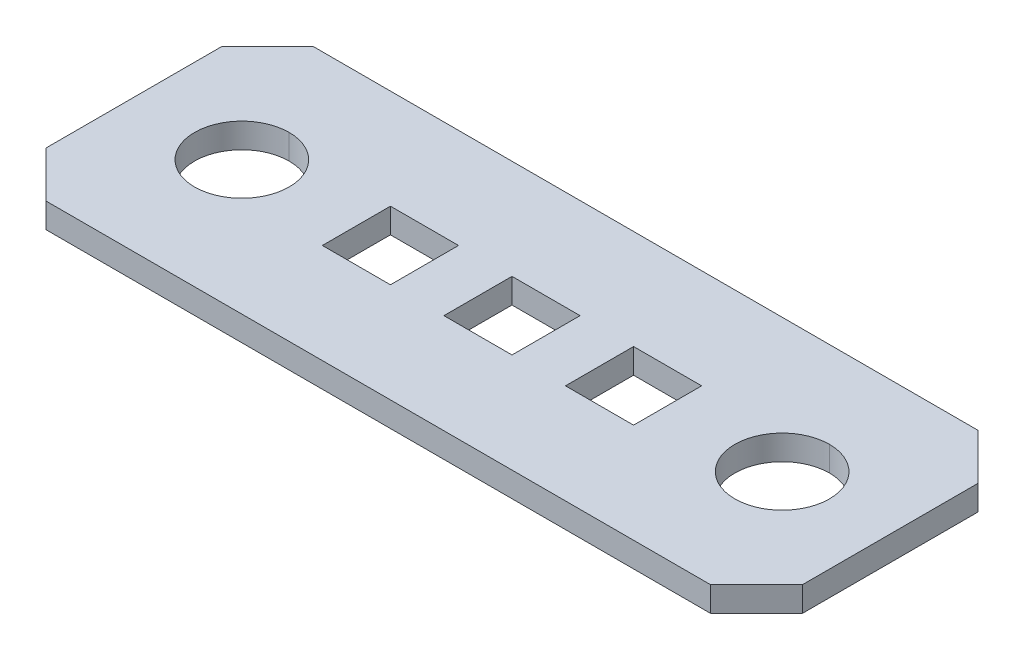
ISO-10303-21;
HEADER;
FILE_DESCRIPTION(('STEP AP214'),'2;1');
FILE_NAME('part.step','',(''),(''),'','','');
FILE_SCHEMA(('AUTOMOTIVE_DESIGN { 1 0 10303 214 1 1 1 1 }'));
ENDSEC;
DATA;
#1=APPLICATION_CONTEXT('core data for automotive mechanical design processes');
#2=APPLICATION_PROTOCOL_DEFINITION('international standard','automotive_design',2000,#1);
#3=PRODUCT_CONTEXT('',#1,'mechanical');
#4=PRODUCT('Part','Part','',(#3));
#5=PRODUCT_RELATED_PRODUCT_CATEGORY('part','',(#4));
#6=PRODUCT_DEFINITION_FORMATION('','',#4);
#7=PRODUCT_DEFINITION_CONTEXT('part definition',#1,'design');
#8=PRODUCT_DEFINITION('design','',#6,#7);
#9=PRODUCT_DEFINITION_SHAPE('','',#8);
#10=(LENGTH_UNIT() NAMED_UNIT(*) SI_UNIT(.MILLI.,.METRE.));
#11=(NAMED_UNIT(*) PLANE_ANGLE_UNIT() SI_UNIT($,.RADIAN.));
#12=(NAMED_UNIT(*) SI_UNIT($,.STERADIAN.) SOLID_ANGLE_UNIT());
#13=UNCERTAINTY_MEASURE_WITH_UNIT(LENGTH_MEASURE(1.E-05),#10,'distance_accuracy_value','');
#14=(GEOMETRIC_REPRESENTATION_CONTEXT(3) GLOBAL_UNCERTAINTY_ASSIGNED_CONTEXT((#13)) GLOBAL_UNIT_ASSIGNED_CONTEXT((#10,
#11,#12)) REPRESENTATION_CONTEXT('',''));
#15=CARTESIAN_POINT('',(0.,0.,0.));
#16=DIRECTION('',(0.,0.,1.));
#17=DIRECTION('',(1.,0.,0.));
#18=AXIS2_PLACEMENT_3D('',#15,#16,#17);
#19=CARTESIAN_POINT('',(21.8948,0.,-7.8867));
#20=DIRECTION('',(0.,0.,-1.));
#21=DIRECTION('',(0.,-1.,0.));
#22=AXIS2_PLACEMENT_3D('',#19,#20,#21);
#23=PLANE('',#22);
#24=DIRECTION('',(-1.,0.,0.));
#25=VECTOR('',#24,1.);
#26=CARTESIAN_POINT('',(21.8948,1.1684,-7.8867));
#27=LINE('',#26,#25);
#28=CARTESIAN_POINT('',(25.0952,1.1684,-7.8867));
#29=VERTEX_POINT('',#28);
#30=CARTESIAN_POINT('',(21.8948,1.1684,-7.8867));
#31=VERTEX_POINT('',#30);
#32=EDGE_CURVE('E10',#29,#31,#27,.T.);
#33=ORIENTED_EDGE('',*,*,#32,.T.);
#34=DIRECTION('',(0.,1.,0.));
#35=VECTOR('',#34,1.);
#36=CARTESIAN_POINT('',(21.8948,0.,-7.8867));
#37=LINE('',#36,#35);
#38=CARTESIAN_POINT('',(21.8948,0.,-7.8867));
#39=VERTEX_POINT('',#38);
#40=EDGE_CURVE('E45',#39,#31,#37,.T.);
#41=ORIENTED_EDGE('',*,*,#40,.F.);
#42=DIRECTION('',(-1.,0.,0.));
#43=VECTOR('',#42,1.);
#44=CARTESIAN_POINT('',(21.8948,0.,-7.8867));
#45=LINE('',#44,#43);
#46=CARTESIAN_POINT('',(25.0952,0.,-7.8867));
#47=VERTEX_POINT('',#46);
#48=EDGE_CURVE('E234',#47,#39,#45,.T.);
#49=ORIENTED_EDGE('',*,*,#48,.F.);
#50=DIRECTION('',(0.,1.,0.));
#51=VECTOR('',#50,1.);
#52=CARTESIAN_POINT('',(25.0952,0.,-7.8867));
#53=LINE('',#52,#51);
#54=EDGE_CURVE('E30',#47,#29,#53,.T.);
#55=ORIENTED_EDGE('',*,*,#54,.T.);
#56=EDGE_LOOP('',(#33,#41,#49,#55));
#57=FACE_BOUND('',#56,.T.);
#58=ADVANCED_FACE('F16',(#57),#23,.F.);
#59=CARTESIAN_POINT('',(0.,0.,0.));
#60=DIRECTION('',(0.,1.,0.));
#61=DIRECTION('',(1.,0.,0.));
#62=AXIS2_PLACEMENT_3D('',#59,#60,#61);
#63=PLANE('',#62);
#64=DIRECTION('',(-1.,0.,0.));
#65=VECTOR('',#64,1.);
#66=CARTESIAN_POINT('',(0.,0.,-12.573));
#67=LINE('',#66,#65);
#68=CARTESIAN_POINT('',(33.401,0.,-12.573));
#69=VERTEX_POINT('',#68);
#70=CARTESIAN_POINT('',(2.159,0.,-12.573));
#71=VERTEX_POINT('',#70);
#72=EDGE_CURVE('E423',#69,#71,#67,.T.);
#73=ORIENTED_EDGE('',*,*,#72,.F.);
#74=DIRECTION('',(0.707106781186544,0.,0.707106781186551));
#75=VECTOR('',#74,1.);
#76=CARTESIAN_POINT('',(33.401,0.,-12.573));
#77=LINE('',#76,#75);
#78=CARTESIAN_POINT('',(35.56,0.,-10.414));
#79=VERTEX_POINT('',#78);
#80=EDGE_CURVE('E283',#69,#79,#77,.T.);
#81=ORIENTED_EDGE('',*,*,#80,.T.);
#82=DIRECTION('',(0.,0.,-1.));
#83=VECTOR('',#82,1.);
#84=CARTESIAN_POINT('',(35.56,0.,-12.573));
#85=LINE('',#84,#83);
#86=CARTESIAN_POINT('',(35.56,0.,-2.159));
#87=VERTEX_POINT('',#86);
#88=EDGE_CURVE('E347',#87,#79,#85,.T.);
#89=ORIENTED_EDGE('',*,*,#88,.F.);
#90=DIRECTION('',(-0.707106781186548,0.,0.707106781186548));
#91=VECTOR('',#90,1.);
#92=CARTESIAN_POINT('',(35.56,0.,-2.159));
#93=LINE('',#92,#91);
#94=CARTESIAN_POINT('',(33.401,0.,0.));
#95=VERTEX_POINT('',#94);
#96=EDGE_CURVE('E401',#87,#95,#93,.T.);
#97=ORIENTED_EDGE('',*,*,#96,.T.);
#98=DIRECTION('',(1.,0.,0.));
#99=VECTOR('',#98,1.);
#100=CARTESIAN_POINT('',(0.,0.,0.));
#101=LINE('',#100,#99);
#102=CARTESIAN_POINT('',(2.159,0.,0.));
#103=VERTEX_POINT('',#102);
#104=EDGE_CURVE('E332',#103,#95,#101,.T.);
#105=ORIENTED_EDGE('',*,*,#104,.F.);
#106=DIRECTION('',(-0.707106781186548,0.,-0.707106781186548));
#107=VECTOR('',#106,1.);
#108=CARTESIAN_POINT('',(2.159,0.,0.));
#109=LINE('',#108,#107);
#110=CARTESIAN_POINT('',(0.,0.,-2.159));
#111=VERTEX_POINT('',#110);
#112=EDGE_CURVE('E398',#103,#111,#109,.T.);
#113=ORIENTED_EDGE('',*,*,#112,.T.);
#114=DIRECTION('',(0.,0.,1.));
#115=VECTOR('',#114,1.);
#116=CARTESIAN_POINT('',(0.,0.,-12.573));
#117=LINE('',#116,#115);
#118=CARTESIAN_POINT('',(0.,0.,-10.414));
#119=VERTEX_POINT('',#118);
#120=EDGE_CURVE('E311',#119,#111,#117,.T.);
#121=ORIENTED_EDGE('',*,*,#120,.F.);
#122=DIRECTION('',(0.707106781186549,0.,-0.707106781186546));
#123=VECTOR('',#122,1.);
#124=CARTESIAN_POINT('',(0.,0.,-10.414));
#125=LINE('',#124,#123);
#126=EDGE_CURVE('E383',#119,#71,#125,.T.);
#127=ORIENTED_EDGE('',*,*,#126,.T.);
#128=EDGE_LOOP('',(#73,#81,#89,#97,#105,#113,#121,#127));
#129=FACE_BOUND('',#128,.T.);
#130=CARTESIAN_POINT('',(30.48,0.,-6.2865));
#131=DIRECTION('',(0.,1.,0.));
#132=DIRECTION('',(0.,0.,1.));
#133=AXIS2_PLACEMENT_3D('',#130,#131,#132);
#134=CIRCLE('',#133,2.2225);
#135=CARTESIAN_POINT('',(30.48,0.,-4.064));
#136=VERTEX_POINT('',#135);
#137=CARTESIAN_POINT('',(30.48,0.,-8.509));
#138=VERTEX_POINT('',#137);
#139=EDGE_CURVE('E377',#136,#138,#134,.T.);
#140=ORIENTED_EDGE('',*,*,#139,.T.);
#141=CARTESIAN_POINT('',(30.48,0.,-6.2865));
#142=DIRECTION('',(0.,1.,0.));
#143=DIRECTION('',(0.,0.,1.));
#144=AXIS2_PLACEMENT_3D('',#141,#142,#143);
#145=CIRCLE('',#144,2.2225);
#146=EDGE_CURVE('E376',#138,#136,#145,.T.);
#147=ORIENTED_EDGE('',*,*,#146,.T.);
#148=EDGE_LOOP('',(#140,#147));
#149=FACE_BOUND('',#148,.T.);
#150=CARTESIAN_POINT('',(5.08,0.,-6.2865));
#151=DIRECTION('',(0.,1.,0.));
#152=DIRECTION('',(0.,0.,1.));
#153=AXIS2_PLACEMENT_3D('',#150,#151,#152);
#154=CIRCLE('',#153,2.2225);
#155=CARTESIAN_POINT('',(5.08,0.,-4.064));
#156=VERTEX_POINT('',#155);
#157=CARTESIAN_POINT('',(5.08,0.,-8.509));
#158=VERTEX_POINT('',#157);
#159=EDGE_CURVE('E379',#156,#158,#154,.T.);
#160=ORIENTED_EDGE('',*,*,#159,.T.);
#161=CARTESIAN_POINT('',(5.08,0.,-6.2865));
#162=DIRECTION('',(0.,1.,0.));
#163=DIRECTION('',(0.,0.,1.));
#164=AXIS2_PLACEMENT_3D('',#161,#162,#163);
#165=CIRCLE('',#164,2.2225);
#166=EDGE_CURVE('E278',#158,#156,#165,.T.);
#167=ORIENTED_EDGE('',*,*,#166,.T.);
#168=EDGE_LOOP('',(#160,#167));
#169=FACE_BOUND('',#168,.T.);
#170=DIRECTION('',(-1.,0.,0.));
#171=VECTOR('',#170,1.);
#172=CARTESIAN_POINT('',(16.1798,0.,-7.8867));
#173=LINE('',#172,#171);
#174=CARTESIAN_POINT('',(19.3802,0.,-7.8867));
#175=VERTEX_POINT('',#174);
#176=CARTESIAN_POINT('',(16.1798,0.,-7.8867));
#177=VERTEX_POINT('',#176);
#178=EDGE_CURVE('E277',#175,#177,#173,.T.);
#179=ORIENTED_EDGE('',*,*,#178,.T.);
#180=DIRECTION('',(0.,0.,1.));
#181=VECTOR('',#180,1.);
#182=CARTESIAN_POINT('',(16.1798,0.,-7.8867));
#183=LINE('',#182,#181);
#184=CARTESIAN_POINT('',(16.1798,0.,-4.6863));
#185=VERTEX_POINT('',#184);
#186=EDGE_CURVE('E281',#177,#185,#183,.T.);
#187=ORIENTED_EDGE('',*,*,#186,.T.);
#188=DIRECTION('',(1.,0.,0.));
#189=VECTOR('',#188,1.);
#190=CARTESIAN_POINT('',(16.1798,0.,-4.6863));
#191=LINE('',#190,#189);
#192=CARTESIAN_POINT('',(19.3802,0.,-4.6863));
#193=VERTEX_POINT('',#192);
#194=EDGE_CURVE('E343',#185,#193,#191,.T.);
#195=ORIENTED_EDGE('',*,*,#194,.T.);
#196=DIRECTION('',(0.,0.,-1.));
#197=VECTOR('',#196,1.);
#198=CARTESIAN_POINT('',(19.3802,0.,-7.8867));
#199=LINE('',#198,#197);
#200=EDGE_CURVE('E341',#193,#175,#199,.T.);
#201=ORIENTED_EDGE('',*,*,#200,.T.);
#202=EDGE_LOOP('',(#179,#187,#195,#201));
#203=FACE_BOUND('',#202,.T.);
#204=DIRECTION('',(-1.,0.,0.));
#205=VECTOR('',#204,1.);
#206=CARTESIAN_POINT('',(10.4648,0.,-7.8867));
#207=LINE('',#206,#205);
#208=CARTESIAN_POINT('',(13.6652,0.,-7.8867));
#209=VERTEX_POINT('',#208);
#210=CARTESIAN_POINT('',(10.4648,0.,-7.8867));
#211=VERTEX_POINT('',#210);
#212=EDGE_CURVE('E342',#209,#211,#207,.T.);
#213=ORIENTED_EDGE('',*,*,#212,.T.);
#214=DIRECTION('',(0.,0.,1.));
#215=VECTOR('',#214,1.);
#216=CARTESIAN_POINT('',(10.4648,0.,-7.8867));
#217=LINE('',#216,#215);
#218=CARTESIAN_POINT('',(10.4648,0.,-4.6863));
#219=VERTEX_POINT('',#218);
#220=EDGE_CURVE('E315',#211,#219,#217,.T.);
#221=ORIENTED_EDGE('',*,*,#220,.T.);
#222=DIRECTION('',(1.,0.,0.));
#223=VECTOR('',#222,1.);
#224=CARTESIAN_POINT('',(10.4648,0.,-4.6863));
#225=LINE('',#224,#223);
#226=CARTESIAN_POINT('',(13.6652,0.,-4.6863));
#227=VERTEX_POINT('',#226);
#228=EDGE_CURVE('E306',#219,#227,#225,.T.);
#229=ORIENTED_EDGE('',*,*,#228,.T.);
#230=DIRECTION('',(0.,0.,-1.));
#231=VECTOR('',#230,1.);
#232=CARTESIAN_POINT('',(13.6652,0.,-7.8867));
#233=LINE('',#232,#231);
#234=EDGE_CURVE('E236',#227,#209,#233,.T.);
#235=ORIENTED_EDGE('',*,*,#234,.T.);
#236=EDGE_LOOP('',(#213,#221,#229,#235));
#237=FACE_BOUND('',#236,.T.);
#238=DIRECTION('',(0.,0.,1.));
#239=VECTOR('',#238,1.);
#240=CARTESIAN_POINT('',(21.8948,0.,-7.8867));
#241=LINE('',#240,#239);
#242=CARTESIAN_POINT('',(21.8948,0.,-4.6863));
#243=VERTEX_POINT('',#242);
#244=EDGE_CURVE('E230',#39,#243,#241,.T.);
#245=ORIENTED_EDGE('',*,*,#244,.T.);
#246=DIRECTION('',(1.,0.,0.));
#247=VECTOR('',#246,1.);
#248=CARTESIAN_POINT('',(21.8948,0.,-4.6863));
#249=LINE('',#248,#247);
#250=CARTESIAN_POINT('',(25.0952,0.,-4.6863));
#251=VERTEX_POINT('',#250);
#252=EDGE_CURVE('E219',#243,#251,#249,.T.);
#253=ORIENTED_EDGE('',*,*,#252,.T.);
#254=DIRECTION('',(0.,0.,-1.));
#255=VECTOR('',#254,1.);
#256=CARTESIAN_POINT('',(25.0952,0.,-7.8867));
#257=LINE('',#256,#255);
#258=EDGE_CURVE('E231',#251,#47,#257,.T.);
#259=ORIENTED_EDGE('',*,*,#258,.T.);
#260=ORIENTED_EDGE('',*,*,#48,.T.);
#261=EDGE_LOOP('',(#245,#253,#259,#260));
#262=FACE_BOUND('',#261,.T.);
#263=ADVANCED_FACE('F232',(#129,#149,#169,#203,#237,#262),#63,.F.);
#264=CARTESIAN_POINT('',(0.,1.1684,0.));
#265=DIRECTION('',(0.,1.,0.));
#266=DIRECTION('',(1.,0.,0.));
#267=AXIS2_PLACEMENT_3D('',#264,#265,#266);
#268=PLANE('',#267);
#269=DIRECTION('',(0.,0.,-1.));
#270=VECTOR('',#269,1.);
#271=CARTESIAN_POINT('',(35.56,1.1684,-12.573));
#272=LINE('',#271,#270);
#273=CARTESIAN_POINT('',(35.56,1.1684,-2.159));
#274=VERTEX_POINT('',#273);
#275=CARTESIAN_POINT('',(35.56,1.1684,-10.414));
#276=VERTEX_POINT('',#275);
#277=EDGE_CURVE('E290',#274,#276,#272,.T.);
#278=ORIENTED_EDGE('',*,*,#277,.T.);
#279=DIRECTION('',(-0.707106781186544,0.,-0.707106781186551));
#280=VECTOR('',#279,1.);
#281=CARTESIAN_POINT('',(22.987,1.1684,-22.987));
#282=LINE('',#281,#280);
#283=CARTESIAN_POINT('',(33.401,1.1684,-12.573));
#284=VERTEX_POINT('',#283);
#285=EDGE_CURVE('E295',#276,#284,#282,.T.);
#286=ORIENTED_EDGE('',*,*,#285,.T.);
#287=DIRECTION('',(-1.,0.,0.));
#288=VECTOR('',#287,1.);
#289=CARTESIAN_POINT('',(0.,1.1684,-12.573));
#290=LINE('',#289,#288);
#291=CARTESIAN_POINT('',(2.159,1.1684,-12.573));
#292=VERTEX_POINT('',#291);
#293=EDGE_CURVE('E316',#284,#292,#290,.T.);
#294=ORIENTED_EDGE('',*,*,#293,.T.);
#295=DIRECTION('',(-0.707106781186549,0.,0.707106781186546));
#296=VECTOR('',#295,1.);
#297=CARTESIAN_POINT('',(-5.207,1.1684,-5.207));
#298=LINE('',#297,#296);
#299=CARTESIAN_POINT('',(0.,1.1684,-10.414));
#300=VERTEX_POINT('',#299);
#301=EDGE_CURVE('E319',#292,#300,#298,.T.);
#302=ORIENTED_EDGE('',*,*,#301,.T.);
#303=DIRECTION('',(0.,0.,1.));
#304=VECTOR('',#303,1.);
#305=CARTESIAN_POINT('',(0.,1.1684,-12.573));
#306=LINE('',#305,#304);
#307=CARTESIAN_POINT('',(0.,1.1684,-2.159));
#308=VERTEX_POINT('',#307);
#309=EDGE_CURVE('E575',#300,#308,#306,.T.);
#310=ORIENTED_EDGE('',*,*,#309,.T.);
#311=DIRECTION('',(0.707106781186548,0.,0.707106781186548));
#312=VECTOR('',#311,1.);
#313=CARTESIAN_POINT('',(1.0795,1.1684,-1.0795));
#314=LINE('',#313,#312);
#315=CARTESIAN_POINT('',(2.159,1.1684,0.));
#316=VERTEX_POINT('',#315);
#317=EDGE_CURVE('E417',#308,#316,#314,.T.);
#318=ORIENTED_EDGE('',*,*,#317,.T.);
#319=DIRECTION('',(1.,0.,0.));
#320=VECTOR('',#319,1.);
#321=CARTESIAN_POINT('',(0.,1.1684,0.));
#322=LINE('',#321,#320);
#323=CARTESIAN_POINT('',(33.401,1.1684,0.));
#324=VERTEX_POINT('',#323);
#325=EDGE_CURVE('E412',#316,#324,#322,.T.);
#326=ORIENTED_EDGE('',*,*,#325,.T.);
#327=DIRECTION('',(0.707106781186548,0.,-0.707106781186548));
#328=VECTOR('',#327,1.);
#329=CARTESIAN_POINT('',(16.7005,1.1684,16.7005));
#330=LINE('',#329,#328);
#331=EDGE_CURVE('E416',#324,#274,#330,.T.);
#332=ORIENTED_EDGE('',*,*,#331,.T.);
#333=EDGE_LOOP('',(#278,#286,#294,#302,#310,#318,#326,#332));
#334=FACE_BOUND('',#333,.T.);
#335=CARTESIAN_POINT('',(30.48,1.1684,-6.2865));
#336=DIRECTION('',(0.,1.,0.));
#337=DIRECTION('',(0.,0.,1.));
#338=AXIS2_PLACEMENT_3D('',#335,#336,#337);
#339=CIRCLE('',#338,2.2225);
#340=CARTESIAN_POINT('',(30.48,1.1684,-4.064));
#341=VERTEX_POINT('',#340);
#342=CARTESIAN_POINT('',(30.48,1.1684,-8.509));
#343=VERTEX_POINT('',#342);
#344=EDGE_CURVE('E270',#341,#343,#339,.T.);
#345=ORIENTED_EDGE('',*,*,#344,.F.);
#346=CARTESIAN_POINT('',(30.48,1.1684,-6.2865));
#347=DIRECTION('',(0.,1.,0.));
#348=DIRECTION('',(0.,0.,1.));
#349=AXIS2_PLACEMENT_3D('',#346,#347,#348);
#350=CIRCLE('',#349,2.2225);
#351=EDGE_CURVE('E437',#343,#341,#350,.T.);
#352=ORIENTED_EDGE('',*,*,#351,.F.);
#353=EDGE_LOOP('',(#345,#352));
#354=FACE_BOUND('',#353,.T.);
#355=CARTESIAN_POINT('',(5.08,1.1684,-6.2865));
#356=DIRECTION('',(0.,1.,0.));
#357=DIRECTION('',(0.,0.,1.));
#358=AXIS2_PLACEMENT_3D('',#355,#356,#357);
#359=CIRCLE('',#358,2.2225);
#360=CARTESIAN_POINT('',(5.08,1.1684,-4.064));
#361=VERTEX_POINT('',#360);
#362=CARTESIAN_POINT('',(5.08,1.1684,-8.509));
#363=VERTEX_POINT('',#362);
#364=EDGE_CURVE('E253',#361,#363,#359,.T.);
#365=ORIENTED_EDGE('',*,*,#364,.F.);
#366=CARTESIAN_POINT('',(5.08,1.1684,-6.2865));
#367=DIRECTION('',(0.,1.,0.));
#368=DIRECTION('',(0.,0.,1.));
#369=AXIS2_PLACEMENT_3D('',#366,#367,#368);
#370=CIRCLE('',#369,2.2225);
#371=EDGE_CURVE('E259',#363,#361,#370,.T.);
#372=ORIENTED_EDGE('',*,*,#371,.F.);
#373=EDGE_LOOP('',(#365,#372));
#374=FACE_BOUND('',#373,.T.);
#375=DIRECTION('',(0.,0.,1.));
#376=VECTOR('',#375,1.);
#377=CARTESIAN_POINT('',(16.1798,1.1684,-7.8867));
#378=LINE('',#377,#376);
#379=CARTESIAN_POINT('',(16.1798,1.1684,-7.8867));
#380=VERTEX_POINT('',#379);
#381=CARTESIAN_POINT('',(16.1798,1.1684,-4.6863));
#382=VERTEX_POINT('',#381);
#383=EDGE_CURVE('E307',#380,#382,#378,.T.);
#384=ORIENTED_EDGE('',*,*,#383,.F.);
#385=DIRECTION('',(-1.,0.,0.));
#386=VECTOR('',#385,1.);
#387=CARTESIAN_POINT('',(16.1798,1.1684,-7.8867));
#388=LINE('',#387,#386);
#389=CARTESIAN_POINT('',(19.3802,1.1684,-7.8867));
#390=VERTEX_POINT('',#389);
#391=EDGE_CURVE('E243',#390,#380,#388,.T.);
#392=ORIENTED_EDGE('',*,*,#391,.F.);
#393=DIRECTION('',(0.,0.,-1.));
#394=VECTOR('',#393,1.);
#395=CARTESIAN_POINT('',(19.3802,1.1684,-7.8867));
#396=LINE('',#395,#394);
#397=CARTESIAN_POINT('',(19.3802,1.1684,-4.6863));
#398=VERTEX_POINT('',#397);
#399=EDGE_CURVE('E291',#398,#390,#396,.T.);
#400=ORIENTED_EDGE('',*,*,#399,.F.);
#401=DIRECTION('',(1.,0.,0.));
#402=VECTOR('',#401,1.);
#403=CARTESIAN_POINT('',(16.1798,1.1684,-4.6863));
#404=LINE('',#403,#402);
#405=EDGE_CURVE('E305',#382,#398,#404,.T.);
#406=ORIENTED_EDGE('',*,*,#405,.F.);
#407=EDGE_LOOP('',(#384,#392,#400,#406));
#408=FACE_BOUND('',#407,.T.);
#409=DIRECTION('',(0.,0.,1.));
#410=VECTOR('',#409,1.);
#411=CARTESIAN_POINT('',(10.4648,1.1684,-7.8867));
#412=LINE('',#411,#410);
#413=CARTESIAN_POINT('',(10.4648,1.1684,-7.8867));
#414=VERTEX_POINT('',#413);
#415=CARTESIAN_POINT('',(10.4648,1.1684,-4.6863));
#416=VERTEX_POINT('',#415);
#417=EDGE_CURVE('E324',#414,#416,#412,.T.);
#418=ORIENTED_EDGE('',*,*,#417,.F.);
#419=DIRECTION('',(-1.,0.,0.));
#420=VECTOR('',#419,1.);
#421=CARTESIAN_POINT('',(10.4648,1.1684,-7.8867));
#422=LINE('',#421,#420);
#423=CARTESIAN_POINT('',(13.6652,1.1684,-7.8867));
#424=VERTEX_POINT('',#423);
#425=EDGE_CURVE('E375',#424,#414,#422,.T.);
#426=ORIENTED_EDGE('',*,*,#425,.F.);
#427=DIRECTION('',(0.,0.,-1.));
#428=VECTOR('',#427,1.);
#429=CARTESIAN_POINT('',(13.6652,1.1684,-7.8867));
#430=LINE('',#429,#428);
#431=CARTESIAN_POINT('',(13.6652,1.1684,-4.6863));
#432=VERTEX_POINT('',#431);
#433=EDGE_CURVE('E333',#432,#424,#430,.T.);
#434=ORIENTED_EDGE('',*,*,#433,.F.);
#435=DIRECTION('',(1.,0.,0.));
#436=VECTOR('',#435,1.);
#437=CARTESIAN_POINT('',(10.4648,1.1684,-4.6863));
#438=LINE('',#437,#436);
#439=EDGE_CURVE('E321',#416,#432,#438,.T.);
#440=ORIENTED_EDGE('',*,*,#439,.F.);
#441=EDGE_LOOP('',(#418,#426,#434,#440));
#442=FACE_BOUND('',#441,.T.);
#443=DIRECTION('',(0.,0.,1.));
#444=VECTOR('',#443,1.);
#445=CARTESIAN_POINT('',(21.8948,1.1684,-7.8867));
#446=LINE('',#445,#444);
#447=CARTESIAN_POINT('',(21.8948,1.1684,-4.6863));
#448=VERTEX_POINT('',#447);
#449=EDGE_CURVE('E241',#31,#448,#446,.T.);
#450=ORIENTED_EDGE('',*,*,#449,.F.);
#451=ORIENTED_EDGE('',*,*,#32,.F.);
#452=DIRECTION('',(0.,0.,-1.));
#453=VECTOR('',#452,1.);
#454=CARTESIAN_POINT('',(25.0952,1.1684,-7.8867));
#455=LINE('',#454,#453);
#456=CARTESIAN_POINT('',(25.0952,1.1684,-4.6863));
#457=VERTEX_POINT('',#456);
#458=EDGE_CURVE('E263',#457,#29,#455,.T.);
#459=ORIENTED_EDGE('',*,*,#458,.F.);
#460=DIRECTION('',(1.,0.,0.));
#461=VECTOR('',#460,1.);
#462=CARTESIAN_POINT('',(21.8948,1.1684,-4.6863));
#463=LINE('',#462,#461);
#464=EDGE_CURVE('E242',#448,#457,#463,.T.);
#465=ORIENTED_EDGE('',*,*,#464,.F.);
#466=EDGE_LOOP('',(#450,#451,#459,#465));
#467=FACE_BOUND('',#466,.T.);
#468=ADVANCED_FACE('F471',(#334,#354,#374,#408,#442,#467),#268,.T.);
#469=CARTESIAN_POINT('',(21.8948,0.,-7.8867));
#470=DIRECTION('',(-1.,0.,0.));
#471=DIRECTION('',(0.,0.,1.));
#472=AXIS2_PLACEMENT_3D('',#469,#470,#471);
#473=PLANE('',#472);
#474=ORIENTED_EDGE('',*,*,#449,.T.);
#475=DIRECTION('',(0.,1.,0.));
#476=VECTOR('',#475,1.);
#477=CARTESIAN_POINT('',(21.8948,0.,-4.6863));
#478=LINE('',#477,#476);
#479=EDGE_CURVE('E221',#243,#448,#478,.T.);
#480=ORIENTED_EDGE('',*,*,#479,.F.);
#481=ORIENTED_EDGE('',*,*,#244,.F.);
#482=ORIENTED_EDGE('',*,*,#40,.T.);
#483=EDGE_LOOP('',(#474,#480,#481,#482));
#484=FACE_BOUND('',#483,.T.);
#485=ADVANCED_FACE('F237',(#484),#473,.F.);
#486=CARTESIAN_POINT('',(25.0952,0.,-7.8867));
#487=DIRECTION('',(1.,0.,0.));
#488=DIRECTION('',(0.,1.,0.));
#489=AXIS2_PLACEMENT_3D('',#486,#487,#488);
#490=PLANE('',#489);
#491=ORIENTED_EDGE('',*,*,#458,.T.);
#492=ORIENTED_EDGE('',*,*,#54,.F.);
#493=ORIENTED_EDGE('',*,*,#258,.F.);
#494=DIRECTION('',(0.,1.,0.));
#495=VECTOR('',#494,1.);
#496=CARTESIAN_POINT('',(25.0952,0.,-4.6863));
#497=LINE('',#496,#495);
#498=EDGE_CURVE('E226',#251,#457,#497,.T.);
#499=ORIENTED_EDGE('',*,*,#498,.T.);
#500=EDGE_LOOP('',(#491,#492,#493,#499));
#501=FACE_BOUND('',#500,.T.);
#502=ADVANCED_FACE('F489',(#501),#490,.F.);
#503=CARTESIAN_POINT('',(35.56,1.1684,-12.573));
#504=DIRECTION('',(-1.,0.,0.));
#505=DIRECTION('',(0.,0.,1.));
#506=AXIS2_PLACEMENT_3D('',#503,#504,#505);
#507=PLANE('',#506);
#508=ORIENTED_EDGE('',*,*,#88,.T.);
#509=DIRECTION('',(0.,1.,0.));
#510=VECTOR('',#509,1.);
#511=CARTESIAN_POINT('',(35.56,1.1684,-10.414));
#512=LINE('',#511,#510);
#513=EDGE_CURVE('E301',#79,#276,#512,.T.);
#514=ORIENTED_EDGE('',*,*,#513,.T.);
#515=ORIENTED_EDGE('',*,*,#277,.F.);
#516=DIRECTION('',(0.,-1.,0.));
#517=VECTOR('',#516,1.);
#518=CARTESIAN_POINT('',(35.56,1.1684,-2.159));
#519=LINE('',#518,#517);
#520=EDGE_CURVE('E300',#274,#87,#519,.T.);
#521=ORIENTED_EDGE('',*,*,#520,.T.);
#522=EDGE_LOOP('',(#508,#514,#515,#521));
#523=FACE_BOUND('',#522,.T.);
#524=ADVANCED_FACE('F594',(#523),#507,.F.);
#525=CARTESIAN_POINT('',(16.1798,0.,-4.6863));
#526=DIRECTION('',(0.,0.,1.));
#527=DIRECTION('',(1.,0.,0.));
#528=AXIS2_PLACEMENT_3D('',#525,#526,#527);
#529=PLANE('',#528);
#530=ORIENTED_EDGE('',*,*,#405,.T.);
#531=DIRECTION('',(0.,1.,0.));
#532=VECTOR('',#531,1.);
#533=CARTESIAN_POINT('',(19.3802,0.,-4.6863));
#534=LINE('',#533,#532);
#535=EDGE_CURVE('E296',#193,#398,#534,.T.);
#536=ORIENTED_EDGE('',*,*,#535,.F.);
#537=ORIENTED_EDGE('',*,*,#194,.F.);
#538=DIRECTION('',(0.,1.,0.));
#539=VECTOR('',#538,1.);
#540=CARTESIAN_POINT('',(16.1798,0.,-4.6863));
#541=LINE('',#540,#539);
#542=EDGE_CURVE('E303',#185,#382,#541,.T.);
#543=ORIENTED_EDGE('',*,*,#542,.T.);
#544=EDGE_LOOP('',(#530,#536,#537,#543));
#545=FACE_BOUND('',#544,.T.);
#546=ADVANCED_FACE('F530',(#545),#529,.F.);
#547=CARTESIAN_POINT('',(16.1798,0.,-7.8867));
#548=DIRECTION('',(-1.,0.,0.));
#549=DIRECTION('',(0.,0.,1.));
#550=AXIS2_PLACEMENT_3D('',#547,#548,#549);
#551=PLANE('',#550);
#552=ORIENTED_EDGE('',*,*,#383,.T.);
#553=ORIENTED_EDGE('',*,*,#542,.F.);
#554=ORIENTED_EDGE('',*,*,#186,.F.);
#555=DIRECTION('',(0.,1.,0.));
#556=VECTOR('',#555,1.);
#557=CARTESIAN_POINT('',(16.1798,0.,-7.8867));
#558=LINE('',#557,#556);
#559=EDGE_CURVE('E393',#177,#380,#558,.T.);
#560=ORIENTED_EDGE('',*,*,#559,.T.);
#561=EDGE_LOOP('',(#552,#553,#554,#560));
#562=FACE_BOUND('',#561,.T.);
#563=ADVANCED_FACE('F524',(#562),#551,.F.);
#564=CARTESIAN_POINT('',(10.4648,0.,-7.8867));
#565=DIRECTION('',(0.,0.,-1.));
#566=DIRECTION('',(0.,-1.,0.));
#567=AXIS2_PLACEMENT_3D('',#564,#565,#566);
#568=PLANE('',#567);
#569=ORIENTED_EDGE('',*,*,#425,.T.);
#570=DIRECTION('',(0.,1.,0.));
#571=VECTOR('',#570,1.);
#572=CARTESIAN_POINT('',(10.4648,0.,-7.8867));
#573=LINE('',#572,#571);
#574=EDGE_CURVE('E329',#211,#414,#573,.T.);
#575=ORIENTED_EDGE('',*,*,#574,.F.);
#576=ORIENTED_EDGE('',*,*,#212,.F.);
#577=DIRECTION('',(0.,1.,0.));
#578=VECTOR('',#577,1.);
#579=CARTESIAN_POINT('',(13.6652,0.,-7.8867));
#580=LINE('',#579,#578);
#581=EDGE_CURVE('E369',#209,#424,#580,.T.);
#582=ORIENTED_EDGE('',*,*,#581,.T.);
#583=EDGE_LOOP('',(#569,#575,#576,#582));
#584=FACE_BOUND('',#583,.T.);
#585=ADVANCED_FACE('F526',(#584),#568,.F.);
#586=CARTESIAN_POINT('',(5.08,0.,-6.2865));
#587=DIRECTION('',(0.,1.,0.));
#588=DIRECTION('',(0.,0.,1.));
#589=AXIS2_PLACEMENT_3D('',#586,#587,#588);
#590=CYLINDRICAL_SURFACE('',#589,2.2225);
#591=DIRECTION('',(0.,1.,0.));
#592=VECTOR('',#591,1.);
#593=CARTESIAN_POINT('',(5.08,0.,-8.509));
#594=LINE('',#593,#592);
#595=EDGE_CURVE('E261',#158,#363,#594,.T.);
#596=ORIENTED_EDGE('',*,*,#595,.F.);
#597=ORIENTED_EDGE('',*,*,#159,.F.);
#598=DIRECTION('',(0.,1.,0.));
#599=VECTOR('',#598,1.);
#600=CARTESIAN_POINT('',(5.08,0.,-4.064));
#601=LINE('',#600,#599);
#602=EDGE_CURVE('E274',#156,#361,#601,.T.);
#603=ORIENTED_EDGE('',*,*,#602,.T.);
#604=ORIENTED_EDGE('',*,*,#364,.T.);
#605=EDGE_LOOP('',(#596,#597,#603,#604));
#606=FACE_BOUND('',#605,.T.);
#607=ADVANCED_FACE('F468',(#606),#590,.F.);
#608=CARTESIAN_POINT('',(21.8948,0.,-4.6863));
#609=DIRECTION('',(0.,0.,1.));
#610=DIRECTION('',(1.,0.,0.));
#611=AXIS2_PLACEMENT_3D('',#608,#609,#610);
#612=PLANE('',#611);
#613=ORIENTED_EDGE('',*,*,#464,.T.);
#614=ORIENTED_EDGE('',*,*,#498,.F.);
#615=ORIENTED_EDGE('',*,*,#252,.F.);
#616=ORIENTED_EDGE('',*,*,#479,.T.);
#617=EDGE_LOOP('',(#613,#614,#615,#616));
#618=FACE_BOUND('',#617,.T.);
#619=ADVANCED_FACE('F225',(#618),#612,.F.);
#620=CARTESIAN_POINT('',(16.1798,0.,-7.8867));
#621=DIRECTION('',(0.,0.,-1.));
#622=DIRECTION('',(0.,-1.,0.));
#623=AXIS2_PLACEMENT_3D('',#620,#621,#622);
#624=PLANE('',#623);
#625=ORIENTED_EDGE('',*,*,#391,.T.);
#626=ORIENTED_EDGE('',*,*,#559,.F.);
#627=ORIENTED_EDGE('',*,*,#178,.F.);
#628=DIRECTION('',(0.,1.,0.));
#629=VECTOR('',#628,1.);
#630=CARTESIAN_POINT('',(19.3802,0.,-7.8867));
#631=LINE('',#630,#629);
#632=EDGE_CURVE('E255',#175,#390,#631,.T.);
#633=ORIENTED_EDGE('',*,*,#632,.T.);
#634=EDGE_LOOP('',(#625,#626,#627,#633));
#635=FACE_BOUND('',#634,.T.);
#636=ADVANCED_FACE('F623',(#635),#624,.F.);
#637=CARTESIAN_POINT('',(0.,1.1684,0.));
#638=DIRECTION('',(0.,0.,-1.));
#639=DIRECTION('',(0.,-1.,0.));
#640=AXIS2_PLACEMENT_3D('',#637,#638,#639);
#641=PLANE('',#640);
#642=ORIENTED_EDGE('',*,*,#104,.T.);
#643=DIRECTION('',(0.,1.,0.));
#644=VECTOR('',#643,1.);
#645=CARTESIAN_POINT('',(33.401,1.1684,0.));
#646=LINE('',#645,#644);
#647=EDGE_CURVE('E331',#95,#324,#646,.T.);
#648=ORIENTED_EDGE('',*,*,#647,.T.);
#649=ORIENTED_EDGE('',*,*,#325,.F.);
#650=DIRECTION('',(0.,-1.,0.));
#651=VECTOR('',#650,1.);
#652=CARTESIAN_POINT('',(2.159,1.1684,0.));
#653=LINE('',#652,#651);
#654=EDGE_CURVE('E328',#316,#103,#653,.T.);
#655=ORIENTED_EDGE('',*,*,#654,.T.);
#656=EDGE_LOOP('',(#642,#648,#649,#655));
#657=FACE_BOUND('',#656,.T.);
#658=ADVANCED_FACE('F506',(#657),#641,.F.);
#659=CARTESIAN_POINT('',(33.401,1.1684,-12.573));
#660=DIRECTION('',(-0.707106781186551,0.,0.707106781186544));
#661=DIRECTION('',(0.,1.,0.));
#662=AXIS2_PLACEMENT_3D('',#659,#660,#661);
#663=PLANE('',#662);
#664=ORIENTED_EDGE('',*,*,#285,.F.);
#665=ORIENTED_EDGE('',*,*,#513,.F.);
#666=ORIENTED_EDGE('',*,*,#80,.F.);
#667=DIRECTION('',(0.,-1.,0.));
#668=VECTOR('',#667,1.);
#669=CARTESIAN_POINT('',(33.401,1.1684,-12.573));
#670=LINE('',#669,#668);
#671=EDGE_CURVE('E389',#284,#69,#670,.T.);
#672=ORIENTED_EDGE('',*,*,#671,.F.);
#673=EDGE_LOOP('',(#664,#665,#666,#672));
#674=FACE_BOUND('',#673,.T.);
#675=ADVANCED_FACE('F504',(#674),#663,.F.);
#676=CARTESIAN_POINT('',(10.4648,0.,-7.8867));
#677=DIRECTION('',(-1.,0.,0.));
#678=DIRECTION('',(0.,0.,1.));
#679=AXIS2_PLACEMENT_3D('',#676,#677,#678);
#680=PLANE('',#679);
#681=ORIENTED_EDGE('',*,*,#417,.T.);
#682=DIRECTION('',(0.,1.,0.));
#683=VECTOR('',#682,1.);
#684=CARTESIAN_POINT('',(10.4648,0.,-4.6863));
#685=LINE('',#684,#683);
#686=EDGE_CURVE('E322',#219,#416,#685,.T.);
#687=ORIENTED_EDGE('',*,*,#686,.F.);
#688=ORIENTED_EDGE('',*,*,#220,.F.);
#689=ORIENTED_EDGE('',*,*,#574,.T.);
#690=EDGE_LOOP('',(#681,#687,#688,#689));
#691=FACE_BOUND('',#690,.T.);
#692=ADVANCED_FACE('F505',(#691),#680,.F.);
#693=CARTESIAN_POINT('',(0.,1.1684,-10.414));
#694=DIRECTION('',(0.707106781186546,0.,0.707106781186549));
#695=DIRECTION('',(0.,-1.,0.));
#696=AXIS2_PLACEMENT_3D('',#693,#694,#695);
#697=PLANE('',#696);
#698=ORIENTED_EDGE('',*,*,#301,.F.);
#699=DIRECTION('',(0.,1.,0.));
#700=VECTOR('',#699,1.);
#701=CARTESIAN_POINT('',(2.159,1.1684,-12.573));
#702=LINE('',#701,#700);
#703=EDGE_CURVE('E339',#71,#292,#702,.T.);
#704=ORIENTED_EDGE('',*,*,#703,.F.);
#705=ORIENTED_EDGE('',*,*,#126,.F.);
#706=DIRECTION('',(0.,-1.,0.));
#707=VECTOR('',#706,1.);
#708=CARTESIAN_POINT('',(0.,1.1684,-10.414));
#709=LINE('',#708,#707);
#710=EDGE_CURVE('E260',#300,#119,#709,.T.);
#711=ORIENTED_EDGE('',*,*,#710,.F.);
#712=EDGE_LOOP('',(#698,#704,#705,#711));
#713=FACE_BOUND('',#712,.T.);
#714=ADVANCED_FACE('F525',(#713),#697,.F.);
#715=CARTESIAN_POINT('',(0.,1.1684,-12.573));
#716=DIRECTION('',(0.,0.,1.));
#717=DIRECTION('',(1.,0.,0.));
#718=AXIS2_PLACEMENT_3D('',#715,#716,#717);
#719=PLANE('',#718);
#720=ORIENTED_EDGE('',*,*,#293,.F.);
#721=ORIENTED_EDGE('',*,*,#671,.T.);
#722=ORIENTED_EDGE('',*,*,#72,.T.);
#723=ORIENTED_EDGE('',*,*,#703,.T.);
#724=EDGE_LOOP('',(#720,#721,#722,#723));
#725=FACE_BOUND('',#724,.T.);
#726=ADVANCED_FACE('F518',(#725),#719,.F.);
#727=CARTESIAN_POINT('',(13.6652,0.,-7.8867));
#728=DIRECTION('',(1.,0.,0.));
#729=DIRECTION('',(0.,1.,0.));
#730=AXIS2_PLACEMENT_3D('',#727,#728,#729);
#731=PLANE('',#730);
#732=ORIENTED_EDGE('',*,*,#433,.T.);
#733=ORIENTED_EDGE('',*,*,#581,.F.);
#734=ORIENTED_EDGE('',*,*,#234,.F.);
#735=DIRECTION('',(0.,1.,0.));
#736=VECTOR('',#735,1.);
#737=CARTESIAN_POINT('',(13.6652,0.,-4.6863));
#738=LINE('',#737,#736);
#739=EDGE_CURVE('E294',#227,#432,#738,.T.);
#740=ORIENTED_EDGE('',*,*,#739,.T.);
#741=EDGE_LOOP('',(#732,#733,#734,#740));
#742=FACE_BOUND('',#741,.T.);
#743=ADVANCED_FACE('F520',(#742),#731,.F.);
#744=CARTESIAN_POINT('',(19.3802,0.,-7.8867));
#745=DIRECTION('',(1.,0.,0.));
#746=DIRECTION('',(0.,1.,0.));
#747=AXIS2_PLACEMENT_3D('',#744,#745,#746);
#748=PLANE('',#747);
#749=ORIENTED_EDGE('',*,*,#399,.T.);
#750=ORIENTED_EDGE('',*,*,#632,.F.);
#751=ORIENTED_EDGE('',*,*,#200,.F.);
#752=ORIENTED_EDGE('',*,*,#535,.T.);
#753=EDGE_LOOP('',(#749,#750,#751,#752));
#754=FACE_BOUND('',#753,.T.);
#755=ADVANCED_FACE('F513',(#754),#748,.F.);
#756=CARTESIAN_POINT('',(0.,1.1684,-12.573));
#757=DIRECTION('',(1.,0.,0.));
#758=DIRECTION('',(0.,1.,0.));
#759=AXIS2_PLACEMENT_3D('',#756,#757,#758);
#760=PLANE('',#759);
#761=ORIENTED_EDGE('',*,*,#309,.F.);
#762=ORIENTED_EDGE('',*,*,#710,.T.);
#763=ORIENTED_EDGE('',*,*,#120,.T.);
#764=DIRECTION('',(0.,1.,0.));
#765=VECTOR('',#764,1.);
#766=CARTESIAN_POINT('',(0.,1.1684,-2.159));
#767=LINE('',#766,#765);
#768=EDGE_CURVE('E20',#111,#308,#767,.T.);
#769=ORIENTED_EDGE('',*,*,#768,.T.);
#770=EDGE_LOOP('',(#761,#762,#763,#769));
#771=FACE_BOUND('',#770,.T.);
#772=ADVANCED_FACE('F516',(#771),#760,.F.);
#773=CARTESIAN_POINT('',(2.159,1.1684,0.));
#774=DIRECTION('',(0.707106781186548,0.,-0.707106781186548));
#775=DIRECTION('',(0.,-1.,0.));
#776=AXIS2_PLACEMENT_3D('',#773,#774,#775);
#777=PLANE('',#776);
#778=ORIENTED_EDGE('',*,*,#317,.F.);
#779=ORIENTED_EDGE('',*,*,#768,.F.);
#780=ORIENTED_EDGE('',*,*,#112,.F.);
#781=ORIENTED_EDGE('',*,*,#654,.F.);
#782=EDGE_LOOP('',(#778,#779,#780,#781));
#783=FACE_BOUND('',#782,.T.);
#784=ADVANCED_FACE('F588',(#783),#777,.F.);
#785=CARTESIAN_POINT('',(10.4648,0.,-4.6863));
#786=DIRECTION('',(0.,0.,1.));
#787=DIRECTION('',(1.,0.,0.));
#788=AXIS2_PLACEMENT_3D('',#785,#786,#787);
#789=PLANE('',#788);
#790=ORIENTED_EDGE('',*,*,#439,.T.);
#791=ORIENTED_EDGE('',*,*,#739,.F.);
#792=ORIENTED_EDGE('',*,*,#228,.F.);
#793=ORIENTED_EDGE('',*,*,#686,.T.);
#794=EDGE_LOOP('',(#790,#791,#792,#793));
#795=FACE_BOUND('',#794,.T.);
#796=ADVANCED_FACE('F18',(#795),#789,.F.);
#797=CARTESIAN_POINT('',(30.48,0.,-6.2865));
#798=DIRECTION('',(0.,1.,0.));
#799=DIRECTION('',(0.,0.,1.));
#800=AXIS2_PLACEMENT_3D('',#797,#798,#799);
#801=CYLINDRICAL_SURFACE('',#800,2.2225);
#802=DIRECTION('',(0.,1.,0.));
#803=VECTOR('',#802,1.);
#804=CARTESIAN_POINT('',(30.48,0.,-8.509));
#805=LINE('',#804,#803);
#806=EDGE_CURVE('E265',#138,#343,#805,.T.);
#807=ORIENTED_EDGE('',*,*,#806,.F.);
#808=ORIENTED_EDGE('',*,*,#139,.F.);
#809=DIRECTION('',(0.,1.,0.));
#810=VECTOR('',#809,1.);
#811=CARTESIAN_POINT('',(30.48,0.,-4.064));
#812=LINE('',#811,#810);
#813=EDGE_CURVE('E271',#136,#341,#812,.T.);
#814=ORIENTED_EDGE('',*,*,#813,.T.);
#815=ORIENTED_EDGE('',*,*,#344,.T.);
#816=EDGE_LOOP('',(#807,#808,#814,#815));
#817=FACE_BOUND('',#816,.T.);
#818=ADVANCED_FACE('F534',(#817),#801,.F.);
#819=CARTESIAN_POINT('',(35.56,1.1684,-2.159));
#820=DIRECTION('',(-0.707106781186548,0.,-0.707106781186548));
#821=DIRECTION('',(-0.707106781186548,0.,0.707106781186548));
#822=AXIS2_PLACEMENT_3D('',#819,#820,#821);
#823=PLANE('',#822);
#824=ORIENTED_EDGE('',*,*,#331,.F.);
#825=ORIENTED_EDGE('',*,*,#647,.F.);
#826=ORIENTED_EDGE('',*,*,#96,.F.);
#827=ORIENTED_EDGE('',*,*,#520,.F.);
#828=EDGE_LOOP('',(#824,#825,#826,#827));
#829=FACE_BOUND('',#828,.T.);
#830=ADVANCED_FACE('F540',(#829),#823,.F.);
#831=CARTESIAN_POINT('',(5.08,0.,-6.2865));
#832=DIRECTION('',(0.,1.,0.));
#833=DIRECTION('',(0.,0.,1.));
#834=AXIS2_PLACEMENT_3D('',#831,#832,#833);
#835=CYLINDRICAL_SURFACE('',#834,2.2225);
#836=ORIENTED_EDGE('',*,*,#166,.F.);
#837=ORIENTED_EDGE('',*,*,#595,.T.);
#838=ORIENTED_EDGE('',*,*,#371,.T.);
#839=ORIENTED_EDGE('',*,*,#602,.F.);
#840=EDGE_LOOP('',(#836,#837,#838,#839));
#841=FACE_BOUND('',#840,.T.);
#842=ADVANCED_FACE('F473',(#841),#835,.F.);
#843=CARTESIAN_POINT('',(30.48,0.,-6.2865));
#844=DIRECTION('',(0.,1.,0.));
#845=DIRECTION('',(0.,0.,1.));
#846=AXIS2_PLACEMENT_3D('',#843,#844,#845);
#847=CYLINDRICAL_SURFACE('',#846,2.2225);
#848=ORIENTED_EDGE('',*,*,#146,.F.);
#849=ORIENTED_EDGE('',*,*,#806,.T.);
#850=ORIENTED_EDGE('',*,*,#351,.T.);
#851=ORIENTED_EDGE('',*,*,#813,.F.);
#852=EDGE_LOOP('',(#848,#849,#850,#851));
#853=FACE_BOUND('',#852,.T.);
#854=ADVANCED_FACE('F507',(#853),#847,.F.);
#855=CLOSED_SHELL('',(#58,#263,#468,#485,#502,#524,#546,#563,#585,#607,#619,#636,#658,#675,#692,
#714,#726,#743,#755,#772,#784,#796,#818,#830,#842,#854));
#856=MANIFOLD_SOLID_BREP('B1',#855);
#857=ADVANCED_BREP_SHAPE_REPRESENTATION('',(#18,#856),#14);
#858=SHAPE_DEFINITION_REPRESENTATION(#9,#857);
ENDSEC;
END-ISO-10303-21;
